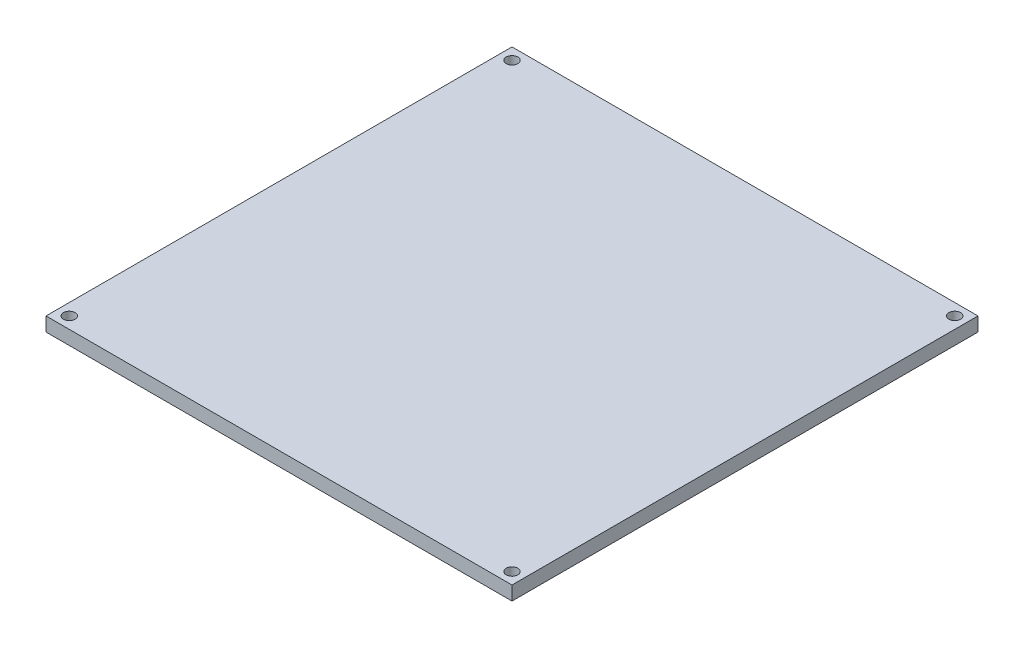
ISO-10303-21;
HEADER;
FILE_DESCRIPTION(('STEP AP214'),'2;1');
FILE_NAME('part.step','',(''),(''),'','','');
FILE_SCHEMA(('AUTOMOTIVE_DESIGN { 1 0 10303 214 1 1 1 1 }'));
ENDSEC;
DATA;
#1=APPLICATION_CONTEXT('core data for automotive mechanical design processes');
#2=APPLICATION_PROTOCOL_DEFINITION('international standard','automotive_design',2000,#1);
#3=PRODUCT_CONTEXT('',#1,'mechanical');
#4=PRODUCT('Part','Part','',(#3));
#5=PRODUCT_RELATED_PRODUCT_CATEGORY('part','',(#4));
#6=PRODUCT_DEFINITION_FORMATION('','',#4);
#7=PRODUCT_DEFINITION_CONTEXT('part definition',#1,'design');
#8=PRODUCT_DEFINITION('design','',#6,#7);
#9=PRODUCT_DEFINITION_SHAPE('','',#8);
#10=(LENGTH_UNIT() NAMED_UNIT(*) SI_UNIT(.MILLI.,.METRE.));
#11=(NAMED_UNIT(*) PLANE_ANGLE_UNIT() SI_UNIT($,.RADIAN.));
#12=(NAMED_UNIT(*) SI_UNIT($,.STERADIAN.) SOLID_ANGLE_UNIT());
#13=UNCERTAINTY_MEASURE_WITH_UNIT(LENGTH_MEASURE(1.E-05),#10,'distance_accuracy_value','');
#14=(GEOMETRIC_REPRESENTATION_CONTEXT(3) GLOBAL_UNCERTAINTY_ASSIGNED_CONTEXT((#13)) GLOBAL_UNIT_ASSIGNED_CONTEXT((#10,
#11,#12)) REPRESENTATION_CONTEXT('',''));
#15=CARTESIAN_POINT('',(0.,0.,0.));
#16=DIRECTION('',(0.,0.,1.));
#17=DIRECTION('',(1.,0.,0.));
#18=AXIS2_PLACEMENT_3D('',#15,#16,#17);
#19=CARTESIAN_POINT('',(0.,3.,0.));
#20=DIRECTION('',(0.,1.,0.));
#21=DIRECTION('',(0.,0.,1.));
#22=AXIS2_PLACEMENT_3D('',#19,#20,#21);
#23=PLANE('',#22);
#24=CARTESIAN_POINT('',(97.5,3.,-97.5));
#25=DIRECTION('',(0.,1.,0.));
#26=DIRECTION('',(0.,0.,1.));
#27=AXIS2_PLACEMENT_3D('',#24,#25,#26);
#28=CIRCLE('',#27,1.25);
#29=CARTESIAN_POINT('',(97.5,3.,-96.25));
#30=VERTEX_POINT('',#29);
#31=EDGE_CURVE('E121',#30,#30,#28,.T.);
#32=ORIENTED_EDGE('',*,*,#31,.F.);
#33=EDGE_LOOP('',(#32));
#34=FACE_BOUND('',#33,.T.);
#35=CARTESIAN_POINT('',(2.5,3.,-97.5));
#36=DIRECTION('',(0.,1.,0.));
#37=DIRECTION('',(0.,0.,1.));
#38=AXIS2_PLACEMENT_3D('',#35,#36,#37);
#39=CIRCLE('',#38,1.25);
#40=CARTESIAN_POINT('',(2.5,3.,-96.25));
#41=VERTEX_POINT('',#40);
#42=EDGE_CURVE('E100',#41,#41,#39,.T.);
#43=ORIENTED_EDGE('',*,*,#42,.F.);
#44=EDGE_LOOP('',(#43));
#45=FACE_BOUND('',#44,.T.);
#46=DIRECTION('',(0.,0.,1.));
#47=VECTOR('',#46,1.);
#48=CARTESIAN_POINT('',(0.,3.,-100.));
#49=LINE('',#48,#47);
#50=CARTESIAN_POINT('',(0.,3.,-100.));
#51=VERTEX_POINT('',#50);
#52=CARTESIAN_POINT('',(0.,3.,0.));
#53=VERTEX_POINT('',#52);
#54=EDGE_CURVE('E85',#51,#53,#49,.T.);
#55=ORIENTED_EDGE('',*,*,#54,.T.);
#56=DIRECTION('',(1.,0.,0.));
#57=VECTOR('',#56,1.);
#58=CARTESIAN_POINT('',(0.,3.,0.));
#59=LINE('',#58,#57);
#60=CARTESIAN_POINT('',(100.,3.,0.));
#61=VERTEX_POINT('',#60);
#62=EDGE_CURVE('E80',#53,#61,#59,.T.);
#63=ORIENTED_EDGE('',*,*,#62,.T.);
#64=DIRECTION('',(0.,0.,-1.));
#65=VECTOR('',#64,1.);
#66=CARTESIAN_POINT('',(100.,3.,0.));
#67=LINE('',#66,#65);
#68=CARTESIAN_POINT('',(100.,3.,-100.));
#69=VERTEX_POINT('',#68);
#70=EDGE_CURVE('E83',#61,#69,#67,.T.);
#71=ORIENTED_EDGE('',*,*,#70,.T.);
#72=DIRECTION('',(-1.,0.,0.));
#73=VECTOR('',#72,1.);
#74=CARTESIAN_POINT('',(100.,3.,-100.));
#75=LINE('',#74,#73);
#76=EDGE_CURVE('E50',#69,#51,#75,.T.);
#77=ORIENTED_EDGE('',*,*,#76,.T.);
#78=EDGE_LOOP('',(#55,#63,#71,#77));
#79=FACE_BOUND('',#78,.T.);
#80=CARTESIAN_POINT('',(2.50000000000001,3.,-2.5));
#81=DIRECTION('',(0.,1.,0.));
#82=DIRECTION('',(0.,0.,1.));
#83=AXIS2_PLACEMENT_3D('',#80,#81,#82);
#84=CIRCLE('',#83,1.25);
#85=CARTESIAN_POINT('',(2.50000000000001,3.,-1.25));
#86=VERTEX_POINT('',#85);
#87=EDGE_CURVE('E115',#86,#86,#84,.T.);
#88=ORIENTED_EDGE('',*,*,#87,.F.);
#89=EDGE_LOOP('',(#88));
#90=FACE_BOUND('',#89,.T.);
#91=CARTESIAN_POINT('',(97.5,3.,-2.5));
#92=DIRECTION('',(0.,1.,0.));
#93=DIRECTION('',(0.,0.,1.));
#94=AXIS2_PLACEMENT_3D('',#91,#92,#93);
#95=CIRCLE('',#94,1.25);
#96=CARTESIAN_POINT('',(97.5,3.,-1.25));
#97=VERTEX_POINT('',#96);
#98=EDGE_CURVE('E127',#97,#97,#95,.T.);
#99=ORIENTED_EDGE('',*,*,#98,.F.);
#100=EDGE_LOOP('',(#99));
#101=FACE_BOUND('',#100,.T.);
#102=ADVANCED_FACE('F33',(#34,#45,#79,#90,#101),#23,.T.);
#103=CARTESIAN_POINT('',(0.,0.,0.));
#104=DIRECTION('',(0.,1.,0.));
#105=DIRECTION('',(0.,0.,1.));
#106=AXIS2_PLACEMENT_3D('',#103,#104,#105);
#107=PLANE('',#106);
#108=DIRECTION('',(0.,0.,1.));
#109=VECTOR('',#108,1.);
#110=CARTESIAN_POINT('',(0.,0.,-100.));
#111=LINE('',#110,#109);
#112=CARTESIAN_POINT('',(0.,0.,-100.));
#113=VERTEX_POINT('',#112);
#114=CARTESIAN_POINT('',(0.,0.,0.));
#115=VERTEX_POINT('',#114);
#116=EDGE_CURVE('E97',#113,#115,#111,.T.);
#117=ORIENTED_EDGE('',*,*,#116,.F.);
#118=DIRECTION('',(-1.,0.,0.));
#119=VECTOR('',#118,1.);
#120=CARTESIAN_POINT('',(100.,0.,-100.));
#121=LINE('',#120,#119);
#122=CARTESIAN_POINT('',(100.,0.,-100.));
#123=VERTEX_POINT('',#122);
#124=EDGE_CURVE('E73',#123,#113,#121,.T.);
#125=ORIENTED_EDGE('',*,*,#124,.F.);
#126=DIRECTION('',(0.,0.,-1.));
#127=VECTOR('',#126,1.);
#128=CARTESIAN_POINT('',(100.,0.,0.));
#129=LINE('',#128,#127);
#130=CARTESIAN_POINT('',(100.,0.,0.));
#131=VERTEX_POINT('',#130);
#132=EDGE_CURVE('E67',#131,#123,#129,.T.);
#133=ORIENTED_EDGE('',*,*,#132,.F.);
#134=DIRECTION('',(1.,0.,0.));
#135=VECTOR('',#134,1.);
#136=CARTESIAN_POINT('',(0.,0.,0.));
#137=LINE('',#136,#135);
#138=EDGE_CURVE('E89',#115,#131,#137,.T.);
#139=ORIENTED_EDGE('',*,*,#138,.F.);
#140=EDGE_LOOP('',(#117,#125,#133,#139));
#141=FACE_BOUND('',#140,.T.);
#142=CARTESIAN_POINT('',(2.5,0.,-97.5));
#143=DIRECTION('',(0.,1.,0.));
#144=DIRECTION('',(0.,0.,1.));
#145=AXIS2_PLACEMENT_3D('',#142,#143,#144);
#146=CIRCLE('',#145,1.25);
#147=CARTESIAN_POINT('',(2.5,0.,-96.25));
#148=VERTEX_POINT('',#147);
#149=EDGE_CURVE('E112',#148,#148,#146,.T.);
#150=ORIENTED_EDGE('',*,*,#149,.T.);
#151=EDGE_LOOP('',(#150));
#152=FACE_BOUND('',#151,.T.);
#153=CARTESIAN_POINT('',(2.50000000000001,0.,-2.5));
#154=DIRECTION('',(0.,1.,0.));
#155=DIRECTION('',(0.,0.,1.));
#156=AXIS2_PLACEMENT_3D('',#153,#154,#155);
#157=CIRCLE('',#156,1.25);
#158=CARTESIAN_POINT('',(2.50000000000001,0.,-1.25));
#159=VERTEX_POINT('',#158);
#160=EDGE_CURVE('E118',#159,#159,#157,.T.);
#161=ORIENTED_EDGE('',*,*,#160,.T.);
#162=EDGE_LOOP('',(#161));
#163=FACE_BOUND('',#162,.T.);
#164=CARTESIAN_POINT('',(97.5,0.,-97.5));
#165=DIRECTION('',(0.,1.,0.));
#166=DIRECTION('',(0.,0.,1.));
#167=AXIS2_PLACEMENT_3D('',#164,#165,#166);
#168=CIRCLE('',#167,1.25);
#169=CARTESIAN_POINT('',(97.5,0.,-96.25));
#170=VERTEX_POINT('',#169);
#171=EDGE_CURVE('E124',#170,#170,#168,.T.);
#172=ORIENTED_EDGE('',*,*,#171,.T.);
#173=EDGE_LOOP('',(#172));
#174=FACE_BOUND('',#173,.T.);
#175=CARTESIAN_POINT('',(97.5,0.,-2.5));
#176=DIRECTION('',(0.,1.,0.));
#177=DIRECTION('',(0.,0.,1.));
#178=AXIS2_PLACEMENT_3D('',#175,#176,#177);
#179=CIRCLE('',#178,1.25);
#180=CARTESIAN_POINT('',(97.5,0.,-1.25));
#181=VERTEX_POINT('',#180);
#182=EDGE_CURVE('E130',#181,#181,#179,.T.);
#183=ORIENTED_EDGE('',*,*,#182,.T.);
#184=EDGE_LOOP('',(#183));
#185=FACE_BOUND('',#184,.T.);
#186=ADVANCED_FACE('F108',(#141,#152,#163,#174,#185),#107,.F.);
#187=CARTESIAN_POINT('',(0.,3.,-100.));
#188=DIRECTION('',(1.,0.,0.));
#189=DIRECTION('',(0.,0.,-1.));
#190=AXIS2_PLACEMENT_3D('',#187,#188,#189);
#191=PLANE('',#190);
#192=ORIENTED_EDGE('',*,*,#116,.T.);
#193=DIRECTION('',(0.,-1.,0.));
#194=VECTOR('',#193,1.);
#195=CARTESIAN_POINT('',(0.,3.,0.));
#196=LINE('',#195,#194);
#197=EDGE_CURVE('E11',#53,#115,#196,.T.);
#198=ORIENTED_EDGE('',*,*,#197,.F.);
#199=ORIENTED_EDGE('',*,*,#54,.F.);
#200=DIRECTION('',(0.,-1.,0.));
#201=VECTOR('',#200,1.);
#202=CARTESIAN_POINT('',(0.,3.,-100.));
#203=LINE('',#202,#201);
#204=EDGE_CURVE('E93',#51,#113,#203,.T.);
#205=ORIENTED_EDGE('',*,*,#204,.T.);
#206=EDGE_LOOP('',(#192,#198,#199,#205));
#207=FACE_BOUND('',#206,.T.);
#208=ADVANCED_FACE('F35',(#207),#191,.F.);
#209=CARTESIAN_POINT('',(0.,3.,0.));
#210=DIRECTION('',(0.,0.,-1.));
#211=DIRECTION('',(-1.,0.,0.));
#212=AXIS2_PLACEMENT_3D('',#209,#210,#211);
#213=PLANE('',#212);
#214=ORIENTED_EDGE('',*,*,#138,.T.);
#215=DIRECTION('',(0.,-1.,0.));
#216=VECTOR('',#215,1.);
#217=CARTESIAN_POINT('',(100.,3.,0.));
#218=LINE('',#217,#216);
#219=EDGE_CURVE('E42',#61,#131,#218,.T.);
#220=ORIENTED_EDGE('',*,*,#219,.F.);
#221=ORIENTED_EDGE('',*,*,#62,.F.);
#222=ORIENTED_EDGE('',*,*,#197,.T.);
#223=EDGE_LOOP('',(#214,#220,#221,#222));
#224=FACE_BOUND('',#223,.T.);
#225=ADVANCED_FACE('F88',(#224),#213,.F.);
#226=CARTESIAN_POINT('',(100.,3.,0.));
#227=DIRECTION('',(-1.,0.,0.));
#228=DIRECTION('',(0.,0.,1.));
#229=AXIS2_PLACEMENT_3D('',#226,#227,#228);
#230=PLANE('',#229);
#231=ORIENTED_EDGE('',*,*,#132,.T.);
#232=DIRECTION('',(0.,-1.,0.));
#233=VECTOR('',#232,1.);
#234=CARTESIAN_POINT('',(100.,3.,-100.));
#235=LINE('',#234,#233);
#236=EDGE_CURVE('E90',#69,#123,#235,.T.);
#237=ORIENTED_EDGE('',*,*,#236,.F.);
#238=ORIENTED_EDGE('',*,*,#70,.F.);
#239=ORIENTED_EDGE('',*,*,#219,.T.);
#240=EDGE_LOOP('',(#231,#237,#238,#239));
#241=FACE_BOUND('',#240,.T.);
#242=ADVANCED_FACE('F91',(#241),#230,.F.);
#243=CARTESIAN_POINT('',(100.,3.,-100.));
#244=DIRECTION('',(0.,0.,1.));
#245=DIRECTION('',(1.,0.,0.));
#246=AXIS2_PLACEMENT_3D('',#243,#244,#245);
#247=PLANE('',#246);
#248=ORIENTED_EDGE('',*,*,#124,.T.);
#249=ORIENTED_EDGE('',*,*,#204,.F.);
#250=ORIENTED_EDGE('',*,*,#76,.F.);
#251=ORIENTED_EDGE('',*,*,#236,.T.);
#252=EDGE_LOOP('',(#248,#249,#250,#251));
#253=FACE_BOUND('',#252,.T.);
#254=ADVANCED_FACE('F105',(#253),#247,.F.);
#255=CARTESIAN_POINT('',(2.5,3.,-97.5));
#256=DIRECTION('',(0.,-1.,0.));
#257=DIRECTION('',(0.,0.,-1.));
#258=AXIS2_PLACEMENT_3D('',#255,#256,#257);
#259=CYLINDRICAL_SURFACE('',#258,1.25);
#260=ORIENTED_EDGE('',*,*,#42,.T.);
#261=EDGE_LOOP('',(#260));
#262=FACE_BOUND('',#261,.T.);
#263=ORIENTED_EDGE('',*,*,#149,.F.);
#264=EDGE_LOOP('',(#263));
#265=FACE_BOUND('',#264,.T.);
#266=ADVANCED_FACE('F149',(#262,#265),#259,.F.);
#267=CARTESIAN_POINT('',(2.50000000000001,3.,-2.5));
#268=DIRECTION('',(0.,-1.,0.));
#269=DIRECTION('',(0.,0.,-1.));
#270=AXIS2_PLACEMENT_3D('',#267,#268,#269);
#271=CYLINDRICAL_SURFACE('',#270,1.25);
#272=ORIENTED_EDGE('',*,*,#87,.T.);
#273=EDGE_LOOP('',(#272));
#274=FACE_BOUND('',#273,.T.);
#275=ORIENTED_EDGE('',*,*,#160,.F.);
#276=EDGE_LOOP('',(#275));
#277=FACE_BOUND('',#276,.T.);
#278=ADVANCED_FACE('F195',(#274,#277),#271,.F.);
#279=CARTESIAN_POINT('',(97.5,3.,-97.5));
#280=DIRECTION('',(0.,-1.,0.));
#281=DIRECTION('',(0.,0.,-1.));
#282=AXIS2_PLACEMENT_3D('',#279,#280,#281);
#283=CYLINDRICAL_SURFACE('',#282,1.25);
#284=ORIENTED_EDGE('',*,*,#31,.T.);
#285=EDGE_LOOP('',(#284));
#286=FACE_BOUND('',#285,.T.);
#287=ORIENTED_EDGE('',*,*,#171,.F.);
#288=EDGE_LOOP('',(#287));
#289=FACE_BOUND('',#288,.T.);
#290=ADVANCED_FACE('F203',(#286,#289),#283,.F.);
#291=CARTESIAN_POINT('',(97.5,3.,-2.5));
#292=DIRECTION('',(0.,-1.,0.));
#293=DIRECTION('',(0.,0.,-1.));
#294=AXIS2_PLACEMENT_3D('',#291,#292,#293);
#295=CYLINDRICAL_SURFACE('',#294,1.25);
#296=ORIENTED_EDGE('',*,*,#98,.T.);
#297=EDGE_LOOP('',(#296));
#298=FACE_BOUND('',#297,.T.);
#299=ORIENTED_EDGE('',*,*,#182,.F.);
#300=EDGE_LOOP('',(#299));
#301=FACE_BOUND('',#300,.T.);
#302=ADVANCED_FACE('F136',(#298,#301),#295,.F.);
#303=CLOSED_SHELL('',(#102,#186,#208,#225,#242,#254,#266,#278,#290,#302));
#304=MANIFOLD_SOLID_BREP('B2',#303);
#305=ADVANCED_BREP_SHAPE_REPRESENTATION('',(#18,#304),#14);
#306=SHAPE_DEFINITION_REPRESENTATION(#9,#305);
ENDSEC;
END-ISO-10303-21;
